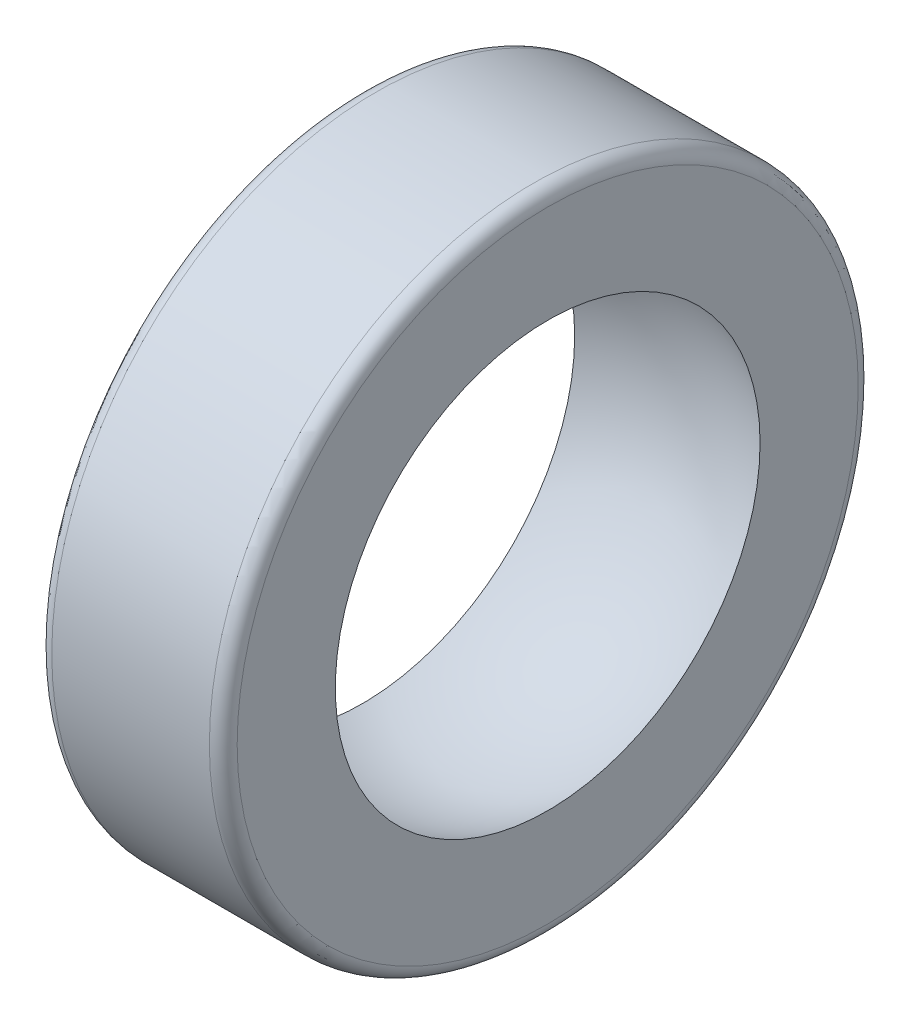
ISO-10303-21;
HEADER;
FILE_DESCRIPTION(('STEP AP214'),'2;1');
FILE_NAME('part.step','',(''),(''),'','','');
FILE_SCHEMA(('AUTOMOTIVE_DESIGN { 1 0 10303 214 1 1 1 1 }'));
ENDSEC;
DATA;
#1=APPLICATION_CONTEXT('core data for automotive mechanical design processes');
#2=APPLICATION_PROTOCOL_DEFINITION('international standard','automotive_design',2000,#1);
#3=PRODUCT_CONTEXT('',#1,'mechanical');
#4=PRODUCT('Part','Part','',(#3));
#5=PRODUCT_RELATED_PRODUCT_CATEGORY('part','',(#4));
#6=PRODUCT_DEFINITION_FORMATION('','',#4);
#7=PRODUCT_DEFINITION_CONTEXT('part definition',#1,'design');
#8=PRODUCT_DEFINITION('design','',#6,#7);
#9=PRODUCT_DEFINITION_SHAPE('','',#8);
#10=(LENGTH_UNIT() NAMED_UNIT(*) SI_UNIT(.MILLI.,.METRE.));
#11=(NAMED_UNIT(*) PLANE_ANGLE_UNIT() SI_UNIT($,.RADIAN.));
#12=(NAMED_UNIT(*) SI_UNIT($,.STERADIAN.) SOLID_ANGLE_UNIT());
#13=UNCERTAINTY_MEASURE_WITH_UNIT(LENGTH_MEASURE(1.E-05),#10,'distance_accuracy_value','');
#14=(GEOMETRIC_REPRESENTATION_CONTEXT(3) GLOBAL_UNCERTAINTY_ASSIGNED_CONTEXT((#13)) GLOBAL_UNIT_ASSIGNED_CONTEXT((#10,
#11,#12)) REPRESENTATION_CONTEXT('',''));
#15=CARTESIAN_POINT('',(0.,0.,0.));
#16=DIRECTION('',(0.,0.,1.));
#17=DIRECTION('',(1.,0.,0.));
#18=AXIS2_PLACEMENT_3D('',#15,#16,#17);
#19=CARTESIAN_POINT('',(0.,0.,0.));
#20=DIRECTION('',(1.,0.,0.));
#21=DIRECTION('',(0.,1.,0.));
#22=AXIS2_PLACEMENT_3D('',#19,#20,#21);
#23=SPHERICAL_SURFACE('',#22,5.);
#24=CARTESIAN_POINT('',(2.,0.,0.));
#25=DIRECTION('',(1.,0.,0.));
#26=DIRECTION('',(0.,0.,-1.));
#27=AXIS2_PLACEMENT_3D('',#24,#25,#26);
#28=CIRCLE('',#27,4.58257569495584);
#29=CARTESIAN_POINT('',(2.,0.,-4.58257569495584));
#30=VERTEX_POINT('',#29);
#31=EDGE_CURVE('E19',#30,#30,#28,.F.);
#32=ORIENTED_EDGE('',*,*,#31,.F.);
#33=EDGE_LOOP('',(#32));
#34=FACE_BOUND('',#33,.T.);
#35=CARTESIAN_POINT('',(-2.,0.,0.));
#36=DIRECTION('',(1.,0.,0.));
#37=DIRECTION('',(0.,0.,-1.));
#38=AXIS2_PLACEMENT_3D('',#35,#36,#37);
#39=CIRCLE('',#38,4.58257569495584);
#40=CARTESIAN_POINT('',(-2.,0.,-4.58257569495584));
#41=VERTEX_POINT('',#40);
#42=EDGE_CURVE('E94',#41,#41,#39,.T.);
#43=ORIENTED_EDGE('',*,*,#42,.F.);
#44=EDGE_LOOP('',(#43));
#45=FACE_BOUND('',#44,.T.);
#46=ADVANCED_FACE('F15',(#34,#45),#23,.F.);
#47=CARTESIAN_POINT('',(2.,5.79128784747792,0.));
#48=DIRECTION('',(1.,0.,0.));
#49=DIRECTION('',(0.,0.,-1.));
#50=AXIS2_PLACEMENT_3D('',#47,#48,#49);
#51=PLANE('',#50);
#52=ORIENTED_EDGE('',*,*,#31,.T.);
#53=EDGE_LOOP('',(#52));
#54=FACE_BOUND('',#53,.T.);
#55=CARTESIAN_POINT('',(2.,0.,0.));
#56=DIRECTION('',(-1.,0.,0.));
#57=DIRECTION('',(0.,1.,0.));
#58=AXIS2_PLACEMENT_3D('',#55,#56,#57);
#59=CIRCLE('',#58,6.7);
#60=CARTESIAN_POINT('',(2.,6.7,0.));
#61=VERTEX_POINT('',#60);
#62=EDGE_CURVE('E66',#61,#61,#59,.T.);
#63=ORIENTED_EDGE('',*,*,#62,.F.);
#64=EDGE_LOOP('',(#63));
#65=FACE_BOUND('',#64,.T.);
#66=ADVANCED_FACE('F71',(#54,#65),#51,.T.);
#67=CARTESIAN_POINT('',(-2.,5.79128784747792,0.));
#68=DIRECTION('',(-1.,0.,0.));
#69=DIRECTION('',(0.,0.,1.));
#70=AXIS2_PLACEMENT_3D('',#67,#68,#69);
#71=PLANE('',#70);
#72=ORIENTED_EDGE('',*,*,#42,.T.);
#73=EDGE_LOOP('',(#72));
#74=FACE_BOUND('',#73,.T.);
#75=CARTESIAN_POINT('',(-2.,0.,0.));
#76=DIRECTION('',(1.,0.,0.));
#77=DIRECTION('',(0.,1.,0.));
#78=AXIS2_PLACEMENT_3D('',#75,#76,#77);
#79=CIRCLE('',#78,6.7);
#80=CARTESIAN_POINT('',(-2.,6.7,0.));
#81=VERTEX_POINT('',#80);
#82=EDGE_CURVE('E28',#81,#81,#79,.T.);
#83=ORIENTED_EDGE('',*,*,#82,.F.);
#84=EDGE_LOOP('',(#83));
#85=FACE_BOUND('',#84,.T.);
#86=ADVANCED_FACE('F79',(#74,#85),#71,.T.);
#87=CARTESIAN_POINT('',(1.7,0.,0.));
#88=DIRECTION('',(1.,0.,0.));
#89=DIRECTION('',(0.,0.,-1.));
#90=AXIS2_PLACEMENT_3D('',#87,#88,#89);
#91=TOROIDAL_SURFACE('',#90,6.7,0.3);
#92=ORIENTED_EDGE('',*,*,#62,.T.);
#93=EDGE_LOOP('',(#92));
#94=FACE_BOUND('',#93,.T.);
#95=CARTESIAN_POINT('',(1.7,0.,0.));
#96=DIRECTION('',(1.,0.,0.));
#97=DIRECTION('',(0.,0.,-1.));
#98=AXIS2_PLACEMENT_3D('',#95,#96,#97);
#99=CIRCLE('',#98,7.);
#100=CARTESIAN_POINT('',(1.7,0.,-7.));
#101=VERTEX_POINT('',#100);
#102=EDGE_CURVE('E23',#101,#101,#99,.F.);
#103=ORIENTED_EDGE('',*,*,#102,.F.);
#104=EDGE_LOOP('',(#103));
#105=FACE_BOUND('',#104,.T.);
#106=ADVANCED_FACE('F46',(#94,#105),#91,.T.);
#107=CARTESIAN_POINT('',(-1.7,0.,0.));
#108=DIRECTION('',(1.,0.,0.));
#109=DIRECTION('',(0.,0.,-1.));
#110=AXIS2_PLACEMENT_3D('',#107,#108,#109);
#111=TOROIDAL_SURFACE('',#110,6.7,0.3);
#112=CARTESIAN_POINT('',(-1.7,0.,0.));
#113=DIRECTION('',(1.,0.,0.));
#114=DIRECTION('',(0.,0.,-1.));
#115=AXIS2_PLACEMENT_3D('',#112,#113,#114);
#116=CIRCLE('',#115,7.);
#117=CARTESIAN_POINT('',(-1.7,0.,-7.));
#118=VERTEX_POINT('',#117);
#119=EDGE_CURVE('E10',#118,#118,#116,.T.);
#120=ORIENTED_EDGE('',*,*,#119,.F.);
#121=EDGE_LOOP('',(#120));
#122=FACE_BOUND('',#121,.T.);
#123=ORIENTED_EDGE('',*,*,#82,.T.);
#124=EDGE_LOOP('',(#123));
#125=FACE_BOUND('',#124,.T.);
#126=ADVANCED_FACE('F40',(#122,#125),#111,.T.);
#127=CARTESIAN_POINT('',(0.,0.,0.));
#128=DIRECTION('',(1.,0.,0.));
#129=DIRECTION('',(0.,0.,-1.));
#130=AXIS2_PLACEMENT_3D('',#127,#128,#129);
#131=CYLINDRICAL_SURFACE('',#130,7.);
#132=ORIENTED_EDGE('',*,*,#119,.T.);
#133=EDGE_LOOP('',(#132));
#134=FACE_BOUND('',#133,.T.);
#135=ORIENTED_EDGE('',*,*,#102,.T.);
#136=EDGE_LOOP('',(#135));
#137=FACE_BOUND('',#136,.T.);
#138=ADVANCED_FACE('F45',(#134,#137),#131,.T.);
#139=CLOSED_SHELL('',(#46,#66,#86,#106,#126,#138));
#140=MANIFOLD_SOLID_BREP('B1',#139);
#141=ADVANCED_BREP_SHAPE_REPRESENTATION('',(#18,#140),#14);
#142=SHAPE_DEFINITION_REPRESENTATION(#9,#141);
ENDSEC;
END-ISO-10303-21;
